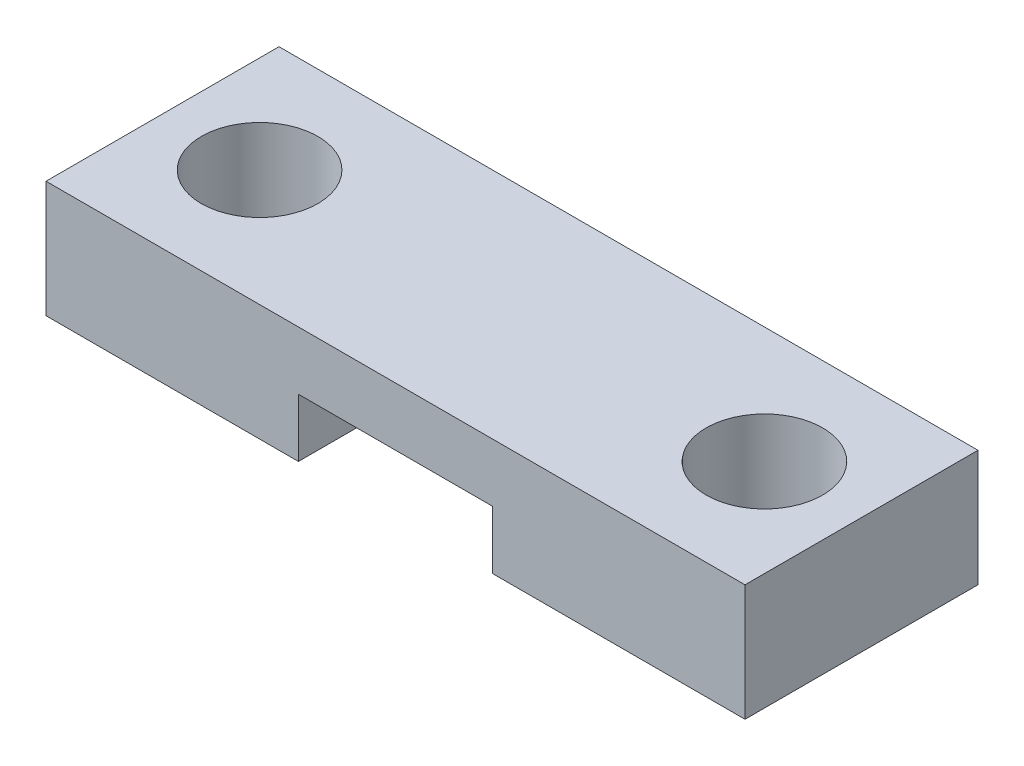
ISO-10303-21;
HEADER;
FILE_DESCRIPTION(('STEP AP214'),'2;1');
FILE_NAME('part.step','',(''),(''),'','','');
FILE_SCHEMA(('AUTOMOTIVE_DESIGN { 1 0 10303 214 1 1 1 1 }'));
ENDSEC;
DATA;
#1=APPLICATION_CONTEXT('core data for automotive mechanical design processes');
#2=APPLICATION_PROTOCOL_DEFINITION('international standard','automotive_design',2000,#1);
#3=PRODUCT_CONTEXT('',#1,'mechanical');
#4=PRODUCT('Part','Part','',(#3));
#5=PRODUCT_RELATED_PRODUCT_CATEGORY('part','',(#4));
#6=PRODUCT_DEFINITION_FORMATION('','',#4);
#7=PRODUCT_DEFINITION_CONTEXT('part definition',#1,'design');
#8=PRODUCT_DEFINITION('design','',#6,#7);
#9=PRODUCT_DEFINITION_SHAPE('','',#8);
#10=(LENGTH_UNIT() NAMED_UNIT(*) SI_UNIT(.MILLI.,.METRE.));
#11=(NAMED_UNIT(*) PLANE_ANGLE_UNIT() SI_UNIT($,.RADIAN.));
#12=(NAMED_UNIT(*) SI_UNIT($,.STERADIAN.) SOLID_ANGLE_UNIT());
#13=UNCERTAINTY_MEASURE_WITH_UNIT(LENGTH_MEASURE(1.E-05),#10,'distance_accuracy_value','');
#14=(GEOMETRIC_REPRESENTATION_CONTEXT(3) GLOBAL_UNCERTAINTY_ASSIGNED_CONTEXT((#13)) GLOBAL_UNIT_ASSIGNED_CONTEXT((#10,
#11,#12)) REPRESENTATION_CONTEXT('',''));
#15=CARTESIAN_POINT('',(0.,0.,0.));
#16=DIRECTION('',(0.,0.,1.));
#17=DIRECTION('',(1.,0.,0.));
#18=AXIS2_PLACEMENT_3D('',#15,#16,#17);
#19=CARTESIAN_POINT('',(0.,0.,0.));
#20=DIRECTION('',(0.,-1.,0.));
#21=DIRECTION('',(0.,0.,-1.));
#22=AXIS2_PLACEMENT_3D('',#19,#20,#21);
#23=PLANE('',#22);
#24=DIRECTION('',(0.,0.,1.));
#25=VECTOR('',#24,1.);
#26=CARTESIAN_POINT('',(-2.5,0.,-3.));
#27=LINE('',#26,#25);
#28=CARTESIAN_POINT('',(-2.5,0.,-3.));
#29=VERTEX_POINT('',#28);
#30=CARTESIAN_POINT('',(-2.5,0.,3.));
#31=VERTEX_POINT('',#30);
#32=EDGE_CURVE('E118',#29,#31,#27,.T.);
#33=ORIENTED_EDGE('',*,*,#32,.T.);
#34=DIRECTION('',(1.,0.,0.));
#35=VECTOR('',#34,1.);
#36=CARTESIAN_POINT('',(-9.,0.,3.));
#37=LINE('',#36,#35);
#38=CARTESIAN_POINT('',(-9.,0.,3.));
#39=VERTEX_POINT('',#38);
#40=EDGE_CURVE('E158',#39,#31,#37,.T.);
#41=ORIENTED_EDGE('',*,*,#40,.F.);
#42=DIRECTION('',(0.,0.,1.));
#43=VECTOR('',#42,1.);
#44=CARTESIAN_POINT('',(-9.,0.,3.));
#45=LINE('',#44,#43);
#46=CARTESIAN_POINT('',(-9.,0.,-3.));
#47=VERTEX_POINT('',#46);
#48=EDGE_CURVE('E143',#47,#39,#45,.T.);
#49=ORIENTED_EDGE('',*,*,#48,.F.);
#50=DIRECTION('',(-1.,0.,0.));
#51=VECTOR('',#50,1.);
#52=CARTESIAN_POINT('',(-9.,0.,-3.));
#53=LINE('',#52,#51);
#54=EDGE_CURVE('E133',#29,#47,#53,.T.);
#55=ORIENTED_EDGE('',*,*,#54,.F.);
#56=EDGE_LOOP('',(#33,#41,#49,#55));
#57=FACE_BOUND('',#56,.T.);
#58=CARTESIAN_POINT('',(-6.5,0.,0.));
#59=DIRECTION('',(0.,1.,0.));
#60=DIRECTION('',(0.,0.,1.));
#61=AXIS2_PLACEMENT_3D('',#58,#59,#60);
#62=CIRCLE('',#61,1.5);
#63=CARTESIAN_POINT('',(-6.5,0.,1.5));
#64=VERTEX_POINT('',#63);
#65=EDGE_CURVE('E182',#64,#64,#62,.T.);
#66=ORIENTED_EDGE('',*,*,#65,.T.);
#67=EDGE_LOOP('',(#66));
#68=FACE_BOUND('',#67,.T.);
#69=ADVANCED_FACE('F43',(#57,#68),#23,.T.);
#70=CARTESIAN_POINT('',(0.,3.,0.));
#71=DIRECTION('',(0.,-1.,0.));
#72=DIRECTION('',(0.,0.,-1.));
#73=AXIS2_PLACEMENT_3D('',#70,#71,#72);
#74=PLANE('',#73);
#75=DIRECTION('',(0.,0.,-1.));
#76=VECTOR('',#75,1.);
#77=CARTESIAN_POINT('',(9.00000000000001,3.,3.));
#78=LINE('',#77,#76);
#79=CARTESIAN_POINT('',(9.00000000000001,3.,3.));
#80=VERTEX_POINT('',#79);
#81=CARTESIAN_POINT('',(9.00000000000001,3.,-3.));
#82=VERTEX_POINT('',#81);
#83=EDGE_CURVE('E161',#80,#82,#78,.T.);
#84=ORIENTED_EDGE('',*,*,#83,.T.);
#85=DIRECTION('',(-1.,0.,0.));
#86=VECTOR('',#85,1.);
#87=CARTESIAN_POINT('',(-9.,3.,-3.));
#88=LINE('',#87,#86);
#89=CARTESIAN_POINT('',(-9.,3.,-3.));
#90=VERTEX_POINT('',#89);
#91=EDGE_CURVE('E95',#82,#90,#88,.T.);
#92=ORIENTED_EDGE('',*,*,#91,.T.);
#93=DIRECTION('',(0.,0.,1.));
#94=VECTOR('',#93,1.);
#95=CARTESIAN_POINT('',(-9.,3.,3.));
#96=LINE('',#95,#94);
#97=CARTESIAN_POINT('',(-9.,3.,3.));
#98=VERTEX_POINT('',#97);
#99=EDGE_CURVE('E173',#90,#98,#96,.T.);
#100=ORIENTED_EDGE('',*,*,#99,.T.);
#101=DIRECTION('',(1.,0.,0.));
#102=VECTOR('',#101,1.);
#103=CARTESIAN_POINT('',(-9.,3.,3.));
#104=LINE('',#103,#102);
#105=EDGE_CURVE('E68',#98,#80,#104,.T.);
#106=ORIENTED_EDGE('',*,*,#105,.T.);
#107=EDGE_LOOP('',(#84,#92,#100,#106));
#108=FACE_BOUND('',#107,.T.);
#109=CARTESIAN_POINT('',(-6.5,3.,0.));
#110=DIRECTION('',(0.,1.,0.));
#111=DIRECTION('',(0.,0.,1.));
#112=AXIS2_PLACEMENT_3D('',#109,#110,#111);
#113=CIRCLE('',#112,1.5);
#114=CARTESIAN_POINT('',(-6.5,3.,1.5));
#115=VERTEX_POINT('',#114);
#116=EDGE_CURVE('E152',#115,#115,#113,.T.);
#117=ORIENTED_EDGE('',*,*,#116,.F.);
#118=EDGE_LOOP('',(#117));
#119=FACE_BOUND('',#118,.T.);
#120=CARTESIAN_POINT('',(6.5,3.,0.));
#121=DIRECTION('',(0.,1.,0.));
#122=DIRECTION('',(0.,0.,1.));
#123=AXIS2_PLACEMENT_3D('',#120,#121,#122);
#124=CIRCLE('',#123,1.5);
#125=CARTESIAN_POINT('',(6.5,3.,1.5));
#126=VERTEX_POINT('',#125);
#127=EDGE_CURVE('E186',#126,#126,#124,.T.);
#128=ORIENTED_EDGE('',*,*,#127,.F.);
#129=EDGE_LOOP('',(#128));
#130=FACE_BOUND('',#129,.T.);
#131=ADVANCED_FACE('F239',(#108,#119,#130),#74,.F.);
#132=DIRECTION('',(0.,0.,1.));
#133=VECTOR('',#132,1.);
#134=CARTESIAN_POINT('',(2.5,0.,-3.));
#135=LINE('',#134,#133);
#136=CARTESIAN_POINT('',(2.5,0.,-3.));
#137=VERTEX_POINT('',#136);
#138=CARTESIAN_POINT('',(2.5,0.,3.));
#139=VERTEX_POINT('',#138);
#140=EDGE_CURVE('E59',#137,#139,#135,.T.);
#141=ORIENTED_EDGE('',*,*,#140,.F.);
#142=CARTESIAN_POINT('',(9.00000000000001,0.,-3.));
#143=VERTEX_POINT('',#142);
#144=EDGE_CURVE('E145',#143,#137,#53,.T.);
#145=ORIENTED_EDGE('',*,*,#144,.F.);
#146=DIRECTION('',(0.,0.,-1.));
#147=VECTOR('',#146,1.);
#148=CARTESIAN_POINT('',(9.00000000000001,0.,3.));
#149=LINE('',#148,#147);
#150=CARTESIAN_POINT('',(9.00000000000001,0.,3.));
#151=VERTEX_POINT('',#150);
#152=EDGE_CURVE('E146',#151,#143,#149,.T.);
#153=ORIENTED_EDGE('',*,*,#152,.F.);
#154=EDGE_CURVE('E88',#139,#151,#37,.T.);
#155=ORIENTED_EDGE('',*,*,#154,.F.);
#156=EDGE_LOOP('',(#141,#145,#153,#155));
#157=FACE_BOUND('',#156,.T.);
#158=CARTESIAN_POINT('',(6.5,0.,0.));
#159=DIRECTION('',(0.,1.,0.));
#160=DIRECTION('',(0.,0.,1.));
#161=AXIS2_PLACEMENT_3D('',#158,#159,#160);
#162=CIRCLE('',#161,1.5);
#163=CARTESIAN_POINT('',(6.5,0.,1.5));
#164=VERTEX_POINT('',#163);
#165=EDGE_CURVE('E190',#164,#164,#162,.T.);
#166=ORIENTED_EDGE('',*,*,#165,.T.);
#167=EDGE_LOOP('',(#166));
#168=FACE_BOUND('',#167,.T.);
#169=ADVANCED_FACE('F218',(#157,#168),#23,.T.);
#170=CARTESIAN_POINT('',(9.00000000000001,3.,3.));
#171=DIRECTION('',(-1.,0.,0.));
#172=DIRECTION('',(0.,0.,1.));
#173=AXIS2_PLACEMENT_3D('',#170,#171,#172);
#174=PLANE('',#173);
#175=ORIENTED_EDGE('',*,*,#152,.T.);
#176=DIRECTION('',(0.,-1.,0.));
#177=VECTOR('',#176,1.);
#178=CARTESIAN_POINT('',(9.00000000000001,3.,-3.));
#179=LINE('',#178,#177);
#180=EDGE_CURVE('E11',#82,#143,#179,.T.);
#181=ORIENTED_EDGE('',*,*,#180,.F.);
#182=ORIENTED_EDGE('',*,*,#83,.F.);
#183=DIRECTION('',(0.,-1.,0.));
#184=VECTOR('',#183,1.);
#185=CARTESIAN_POINT('',(9.00000000000001,3.,3.));
#186=LINE('',#185,#184);
#187=EDGE_CURVE('E162',#80,#151,#186,.T.);
#188=ORIENTED_EDGE('',*,*,#187,.T.);
#189=EDGE_LOOP('',(#175,#181,#182,#188));
#190=FACE_BOUND('',#189,.T.);
#191=ADVANCED_FACE('F45',(#190),#174,.F.);
#192=CARTESIAN_POINT('',(-9.,3.,-3.));
#193=DIRECTION('',(0.,0.,1.));
#194=DIRECTION('',(1.,0.,0.));
#195=AXIS2_PLACEMENT_3D('',#192,#193,#194);
#196=PLANE('',#195);
#197=DIRECTION('',(-1.,0.,0.));
#198=VECTOR('',#197,1.);
#199=CARTESIAN_POINT('',(-2.5,1.5,-3.));
#200=LINE('',#199,#198);
#201=CARTESIAN_POINT('',(2.5,1.5,-3.));
#202=VERTEX_POINT('',#201);
#203=CARTESIAN_POINT('',(-2.5,1.5,-3.));
#204=VERTEX_POINT('',#203);
#205=EDGE_CURVE('E130',#202,#204,#200,.T.);
#206=ORIENTED_EDGE('',*,*,#205,.T.);
#207=DIRECTION('',(0.,-1.,0.));
#208=VECTOR('',#207,1.);
#209=CARTESIAN_POINT('',(-2.5,0.,-3.));
#210=LINE('',#209,#208);
#211=EDGE_CURVE('E121',#204,#29,#210,.T.);
#212=ORIENTED_EDGE('',*,*,#211,.T.);
#213=ORIENTED_EDGE('',*,*,#54,.T.);
#214=DIRECTION('',(0.,-1.,0.));
#215=VECTOR('',#214,1.);
#216=CARTESIAN_POINT('',(-9.,3.,-3.));
#217=LINE('',#216,#215);
#218=EDGE_CURVE('E52',#90,#47,#217,.T.);
#219=ORIENTED_EDGE('',*,*,#218,.F.);
#220=ORIENTED_EDGE('',*,*,#91,.F.);
#221=ORIENTED_EDGE('',*,*,#180,.T.);
#222=ORIENTED_EDGE('',*,*,#144,.T.);
#223=DIRECTION('',(0.,1.,0.));
#224=VECTOR('',#223,1.);
#225=CARTESIAN_POINT('',(2.5,0.,-3.));
#226=LINE('',#225,#224);
#227=EDGE_CURVE('E138',#137,#202,#226,.T.);
#228=ORIENTED_EDGE('',*,*,#227,.T.);
#229=EDGE_LOOP('',(#206,#212,#213,#219,#220,#221,#222,#228));
#230=FACE_BOUND('',#229,.T.);
#231=ADVANCED_FACE('F132',(#230),#196,.F.);
#232=CARTESIAN_POINT('',(-9.,3.,3.));
#233=DIRECTION('',(1.,0.,0.));
#234=DIRECTION('',(0.,0.,-1.));
#235=AXIS2_PLACEMENT_3D('',#232,#233,#234);
#236=PLANE('',#235);
#237=ORIENTED_EDGE('',*,*,#48,.T.);
#238=DIRECTION('',(0.,-1.,0.));
#239=VECTOR('',#238,1.);
#240=CARTESIAN_POINT('',(-9.,3.,3.));
#241=LINE('',#240,#239);
#242=EDGE_CURVE('E165',#98,#39,#241,.T.);
#243=ORIENTED_EDGE('',*,*,#242,.F.);
#244=ORIENTED_EDGE('',*,*,#99,.F.);
#245=ORIENTED_EDGE('',*,*,#218,.T.);
#246=EDGE_LOOP('',(#237,#243,#244,#245));
#247=FACE_BOUND('',#246,.T.);
#248=ADVANCED_FACE('F171',(#247),#236,.F.);
#249=CARTESIAN_POINT('',(-9.,3.,3.));
#250=DIRECTION('',(0.,0.,-1.));
#251=DIRECTION('',(-1.,0.,0.));
#252=AXIS2_PLACEMENT_3D('',#249,#250,#251);
#253=PLANE('',#252);
#254=ORIENTED_EDGE('',*,*,#40,.T.);
#255=DIRECTION('',(0.,-1.,0.));
#256=VECTOR('',#255,1.);
#257=CARTESIAN_POINT('',(-2.5,0.,3.));
#258=LINE('',#257,#256);
#259=CARTESIAN_POINT('',(-2.5,1.5,3.));
#260=VERTEX_POINT('',#259);
#261=EDGE_CURVE('E124',#260,#31,#258,.T.);
#262=ORIENTED_EDGE('',*,*,#261,.F.);
#263=DIRECTION('',(-1.,0.,0.));
#264=VECTOR('',#263,1.);
#265=CARTESIAN_POINT('',(-2.5,1.5,3.));
#266=LINE('',#265,#264);
#267=CARTESIAN_POINT('',(2.5,1.5,3.));
#268=VERTEX_POINT('',#267);
#269=EDGE_CURVE('E139',#268,#260,#266,.T.);
#270=ORIENTED_EDGE('',*,*,#269,.F.);
#271=DIRECTION('',(0.,1.,0.));
#272=VECTOR('',#271,1.);
#273=CARTESIAN_POINT('',(2.5,0.,3.));
#274=LINE('',#273,#272);
#275=EDGE_CURVE('E208',#139,#268,#274,.T.);
#276=ORIENTED_EDGE('',*,*,#275,.F.);
#277=ORIENTED_EDGE('',*,*,#154,.T.);
#278=ORIENTED_EDGE('',*,*,#187,.F.);
#279=ORIENTED_EDGE('',*,*,#105,.F.);
#280=ORIENTED_EDGE('',*,*,#242,.T.);
#281=EDGE_LOOP('',(#254,#262,#270,#276,#277,#278,#279,#280));
#282=FACE_BOUND('',#281,.T.);
#283=ADVANCED_FACE('F225',(#282),#253,.F.);
#284=CARTESIAN_POINT('',(-6.5,3.,0.));
#285=DIRECTION('',(0.,-1.,0.));
#286=DIRECTION('',(0.,0.,-1.));
#287=AXIS2_PLACEMENT_3D('',#284,#285,#286);
#288=CYLINDRICAL_SURFACE('',#287,1.5);
#289=ORIENTED_EDGE('',*,*,#116,.T.);
#290=EDGE_LOOP('',(#289));
#291=FACE_BOUND('',#290,.T.);
#292=ORIENTED_EDGE('',*,*,#65,.F.);
#293=EDGE_LOOP('',(#292));
#294=FACE_BOUND('',#293,.T.);
#295=ADVANCED_FACE('F258',(#291,#294),#288,.F.);
#296=CARTESIAN_POINT('',(6.5,3.,0.));
#297=DIRECTION('',(0.,-1.,0.));
#298=DIRECTION('',(0.,0.,-1.));
#299=AXIS2_PLACEMENT_3D('',#296,#297,#298);
#300=CYLINDRICAL_SURFACE('',#299,1.5);
#301=ORIENTED_EDGE('',*,*,#127,.T.);
#302=EDGE_LOOP('',(#301));
#303=FACE_BOUND('',#302,.T.);
#304=ORIENTED_EDGE('',*,*,#165,.F.);
#305=EDGE_LOOP('',(#304));
#306=FACE_BOUND('',#305,.T.);
#307=ADVANCED_FACE('F236',(#303,#306),#300,.F.);
#308=CARTESIAN_POINT('',(-2.5,0.,-3.));
#309=DIRECTION('',(-1.,0.,0.));
#310=DIRECTION('',(0.,-1.,0.));
#311=AXIS2_PLACEMENT_3D('',#308,#309,#310);
#312=PLANE('',#311);
#313=ORIENTED_EDGE('',*,*,#261,.T.);
#314=ORIENTED_EDGE('',*,*,#32,.F.);
#315=ORIENTED_EDGE('',*,*,#211,.F.);
#316=DIRECTION('',(0.,0.,1.));
#317=VECTOR('',#316,1.);
#318=CARTESIAN_POINT('',(-2.5,1.5,-3.));
#319=LINE('',#318,#317);
#320=EDGE_CURVE('E194',#204,#260,#319,.T.);
#321=ORIENTED_EDGE('',*,*,#320,.T.);
#322=EDGE_LOOP('',(#313,#314,#315,#321));
#323=FACE_BOUND('',#322,.T.);
#324=ADVANCED_FACE('F120',(#323),#312,.F.);
#325=CARTESIAN_POINT('',(-2.5,1.5,-3.));
#326=DIRECTION('',(0.,1.,0.));
#327=DIRECTION('',(0.,0.,1.));
#328=AXIS2_PLACEMENT_3D('',#325,#326,#327);
#329=PLANE('',#328);
#330=ORIENTED_EDGE('',*,*,#269,.T.);
#331=ORIENTED_EDGE('',*,*,#320,.F.);
#332=ORIENTED_EDGE('',*,*,#205,.F.);
#333=DIRECTION('',(0.,0.,1.));
#334=VECTOR('',#333,1.);
#335=CARTESIAN_POINT('',(2.5,1.5,-3.));
#336=LINE('',#335,#334);
#337=EDGE_CURVE('E200',#202,#268,#336,.T.);
#338=ORIENTED_EDGE('',*,*,#337,.T.);
#339=EDGE_LOOP('',(#330,#331,#332,#338));
#340=FACE_BOUND('',#339,.T.);
#341=ADVANCED_FACE('F228',(#340),#329,.F.);
#342=CARTESIAN_POINT('',(2.5,0.,-3.));
#343=DIRECTION('',(1.,0.,0.));
#344=DIRECTION('',(0.,1.,0.));
#345=AXIS2_PLACEMENT_3D('',#342,#343,#344);
#346=PLANE('',#345);
#347=ORIENTED_EDGE('',*,*,#275,.T.);
#348=ORIENTED_EDGE('',*,*,#337,.F.);
#349=ORIENTED_EDGE('',*,*,#227,.F.);
#350=ORIENTED_EDGE('',*,*,#140,.T.);
#351=EDGE_LOOP('',(#347,#348,#349,#350));
#352=FACE_BOUND('',#351,.T.);
#353=ADVANCED_FACE('F216',(#352),#346,.F.);
#354=CLOSED_SHELL('',(#69,#131,#169,#191,#231,#248,#283,#295,#307,#324,#341,#353));
#355=MANIFOLD_SOLID_BREP('B2',#354);
#356=ADVANCED_BREP_SHAPE_REPRESENTATION('',(#18,#355),#14);
#357=SHAPE_DEFINITION_REPRESENTATION(#9,#356);
ENDSEC;
END-ISO-10303-21;
